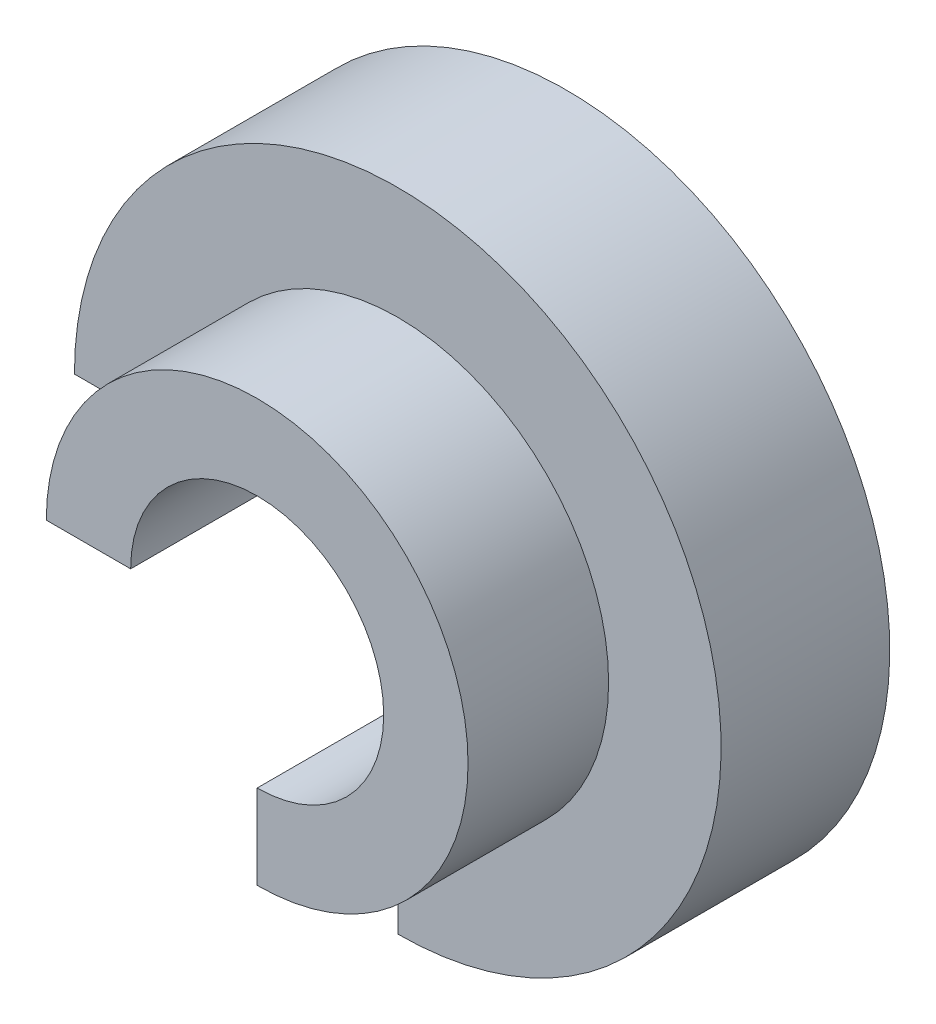
ISO-10303-21;
HEADER;
FILE_DESCRIPTION(('STEP AP214'),'2;1');
FILE_NAME('part.step','',(''),(''),'','','');
FILE_SCHEMA(('AUTOMOTIVE_DESIGN { 1 0 10303 214 1 1 1 1 }'));
ENDSEC;
DATA;
#1=APPLICATION_CONTEXT('core data for automotive mechanical design processes');
#2=APPLICATION_PROTOCOL_DEFINITION('international standard','automotive_design',2000,#1);
#3=PRODUCT_CONTEXT('',#1,'mechanical');
#4=PRODUCT('Part','Part','',(#3));
#5=PRODUCT_RELATED_PRODUCT_CATEGORY('part','',(#4));
#6=PRODUCT_DEFINITION_FORMATION('','',#4);
#7=PRODUCT_DEFINITION_CONTEXT('part definition',#1,'design');
#8=PRODUCT_DEFINITION('design','',#6,#7);
#9=PRODUCT_DEFINITION_SHAPE('','',#8);
#10=(LENGTH_UNIT() NAMED_UNIT(*) SI_UNIT(.MILLI.,.METRE.));
#11=(NAMED_UNIT(*) PLANE_ANGLE_UNIT() SI_UNIT($,.RADIAN.));
#12=(NAMED_UNIT(*) SI_UNIT($,.STERADIAN.) SOLID_ANGLE_UNIT());
#13=UNCERTAINTY_MEASURE_WITH_UNIT(LENGTH_MEASURE(1.E-05),#10,'distance_accuracy_value','');
#14=(GEOMETRIC_REPRESENTATION_CONTEXT(3) GLOBAL_UNCERTAINTY_ASSIGNED_CONTEXT((#13)) GLOBAL_UNIT_ASSIGNED_CONTEXT((#10,
#11,#12)) REPRESENTATION_CONTEXT('',''));
#15=CARTESIAN_POINT('',(0.,0.,0.));
#16=DIRECTION('',(0.,0.,1.));
#17=DIRECTION('',(1.,0.,0.));
#18=AXIS2_PLACEMENT_3D('',#15,#16,#17);
#19=CARTESIAN_POINT('',(0.,0.,150.));
#20=DIRECTION('',(0.,0.,1.));
#21=DIRECTION('',(1.,0.,0.));
#22=AXIS2_PLACEMENT_3D('',#19,#20,#21);
#23=CYLINDRICAL_SURFACE('',#22,59.9999999999999);
#24=CARTESIAN_POINT('',(0.,0.,-150.));
#25=DIRECTION('',(0.,0.,1.));
#26=DIRECTION('',(1.,0.,0.));
#27=AXIS2_PLACEMENT_3D('',#24,#25,#26);
#28=CIRCLE('',#27,59.9999999999999);
#29=CARTESIAN_POINT('',(-6.83575746953394E-13,-59.9999999999999,-150.));
#30=VERTEX_POINT('',#29);
#31=CARTESIAN_POINT('',(-60.,0.,-150.));
#32=VERTEX_POINT('',#31);
#33=EDGE_CURVE('E11',#30,#32,#28,.T.);
#34=ORIENTED_EDGE('',*,*,#33,.F.);
#35=DIRECTION('',(0.,0.,-1.));
#36=VECTOR('',#35,1.);
#37=CARTESIAN_POINT('',(-6.7622786615851E-13,-60.,-110.));
#38=LINE('',#37,#36);
#39=CARTESIAN_POINT('',(-6.7622786615851E-13,-60.,-110.));
#40=VERTEX_POINT('',#39);
#41=EDGE_CURVE('E222',#40,#30,#38,.T.);
#42=ORIENTED_EDGE('',*,*,#41,.F.);
#43=CARTESIAN_POINT('',(0.,0.,-110.));
#44=DIRECTION('',(0.,0.,1.));
#45=DIRECTION('',(1.,0.,0.));
#46=AXIS2_PLACEMENT_3D('',#43,#44,#45);
#47=CIRCLE('',#46,60.);
#48=CARTESIAN_POINT('',(-60.,0.,-110.));
#49=VERTEX_POINT('',#48);
#50=EDGE_CURVE('E48',#40,#49,#47,.T.);
#51=ORIENTED_EDGE('',*,*,#50,.T.);
#52=DIRECTION('',(0.,0.,-1.));
#53=VECTOR('',#52,1.);
#54=CARTESIAN_POINT('',(-60.,0.,-110.));
#55=LINE('',#54,#53);
#56=EDGE_CURVE('E168',#49,#32,#55,.T.);
#57=ORIENTED_EDGE('',*,*,#56,.T.);
#58=EDGE_LOOP('',(#34,#42,#51,#57));
#59=FACE_BOUND('',#58,.T.);
#60=ADVANCED_FACE('F33',(#59),#23,.F.);
#61=CARTESIAN_POINT('',(-6.83575746953394E-13,-59.9999999999999,-150.));
#62=DIRECTION('',(0.,0.,1.));
#63=DIRECTION('',(1.,0.,0.));
#64=AXIS2_PLACEMENT_3D('',#61,#62,#63);
#65=PLANE('',#64);
#66=CARTESIAN_POINT('',(0.,0.,-150.));
#67=DIRECTION('',(0.,0.,1.));
#68=DIRECTION('',(1.,0.,0.));
#69=AXIS2_PLACEMENT_3D('',#66,#67,#68);
#70=CIRCLE('',#69,110.);
#71=CARTESIAN_POINT('',(-1.20729794777986E-12,-110.,-150.));
#72=VERTEX_POINT('',#71);
#73=CARTESIAN_POINT('',(-110.,0.,-150.));
#74=VERTEX_POINT('',#73);
#75=EDGE_CURVE('E41',#72,#74,#70,.T.);
#76=ORIENTED_EDGE('',*,*,#75,.F.);
#77=DIRECTION('',(0.,-1.,0.));
#78=VECTOR('',#77,1.);
#79=CARTESIAN_POINT('',(-6.83575746953394E-13,-59.9999999999999,-150.));
#80=LINE('',#79,#78);
#81=EDGE_CURVE('E164',#30,#72,#80,.T.);
#82=ORIENTED_EDGE('',*,*,#81,.F.);
#83=ORIENTED_EDGE('',*,*,#33,.T.);
#84=DIRECTION('',(-1.,0.,0.));
#85=VECTOR('',#84,1.);
#86=CARTESIAN_POINT('',(-60.,0.,-150.));
#87=LINE('',#86,#85);
#88=EDGE_CURVE('E161',#32,#74,#87,.T.);
#89=ORIENTED_EDGE('',*,*,#88,.T.);
#90=EDGE_LOOP('',(#76,#82,#83,#89));
#91=FACE_BOUND('',#90,.T.);
#92=ADVANCED_FACE('F35',(#91),#65,.F.);
#93=CARTESIAN_POINT('',(0.,0.,150.));
#94=DIRECTION('',(0.,0.,1.));
#95=DIRECTION('',(1.,0.,0.));
#96=AXIS2_PLACEMENT_3D('',#93,#94,#95);
#97=CYLINDRICAL_SURFACE('',#96,110.);
#98=CARTESIAN_POINT('',(0.,0.,-110.));
#99=DIRECTION('',(0.,0.,1.));
#100=DIRECTION('',(1.,0.,0.));
#101=AXIS2_PLACEMENT_3D('',#98,#99,#100);
#102=CIRCLE('',#101,110.);
#103=CARTESIAN_POINT('',(-1.19995006698498E-12,-110.,-110.));
#104=VERTEX_POINT('',#103);
#105=CARTESIAN_POINT('',(-110.,0.,-110.));
#106=VERTEX_POINT('',#105);
#107=EDGE_CURVE('E300',#104,#106,#102,.T.);
#108=ORIENTED_EDGE('',*,*,#107,.F.);
#109=DIRECTION('',(0.,0.,1.));
#110=VECTOR('',#109,1.);
#111=CARTESIAN_POINT('',(-1.20729794777986E-12,-110.,-150.));
#112=LINE('',#111,#110);
#113=EDGE_CURVE('E225',#72,#104,#112,.T.);
#114=ORIENTED_EDGE('',*,*,#113,.F.);
#115=ORIENTED_EDGE('',*,*,#75,.T.);
#116=DIRECTION('',(0.,0.,1.));
#117=VECTOR('',#116,1.);
#118=CARTESIAN_POINT('',(-110.,0.,-150.));
#119=LINE('',#118,#117);
#120=EDGE_CURVE('E175',#74,#106,#119,.T.);
#121=ORIENTED_EDGE('',*,*,#120,.T.);
#122=EDGE_LOOP('',(#108,#114,#115,#121));
#123=FACE_BOUND('',#122,.T.);
#124=ADVANCED_FACE('F303',(#123),#97,.T.);
#125=CARTESIAN_POINT('',(-1.19995006698498E-12,-110.,-110.));
#126=DIRECTION('',(0.,0.,1.));
#127=DIRECTION('',(1.,0.,0.));
#128=AXIS2_PLACEMENT_3D('',#125,#126,#127);
#129=PLANE('',#128);
#130=CARTESIAN_POINT('',(0.,0.,-110.));
#131=DIRECTION('',(0.,0.,1.));
#132=DIRECTION('',(1.,0.,0.));
#133=AXIS2_PLACEMENT_3D('',#130,#131,#132);
#134=CIRCLE('',#133,170.);
#135=CARTESIAN_POINT('',(-1.82841670797674E-12,-170.,-110.));
#136=VERTEX_POINT('',#135);
#137=CARTESIAN_POINT('',(-170.,0.,-110.));
#138=VERTEX_POINT('',#137);
#139=EDGE_CURVE('E298',#136,#138,#134,.T.);
#140=ORIENTED_EDGE('',*,*,#139,.F.);
#141=DIRECTION('',(0.,-1.,0.));
#142=VECTOR('',#141,1.);
#143=CARTESIAN_POINT('',(-1.19995006698498E-12,-110.,-110.));
#144=LINE('',#143,#142);
#145=EDGE_CURVE('E228',#104,#136,#144,.T.);
#146=ORIENTED_EDGE('',*,*,#145,.F.);
#147=ORIENTED_EDGE('',*,*,#107,.T.);
#148=DIRECTION('',(-1.,0.,0.));
#149=VECTOR('',#148,1.);
#150=CARTESIAN_POINT('',(-110.,0.,-110.));
#151=LINE('',#150,#149);
#152=EDGE_CURVE('E177',#106,#138,#151,.T.);
#153=ORIENTED_EDGE('',*,*,#152,.T.);
#154=EDGE_LOOP('',(#140,#146,#147,#153));
#155=FACE_BOUND('',#154,.T.);
#156=ADVANCED_FACE('F359',(#155),#129,.F.);
#157=CARTESIAN_POINT('',(0.,0.,150.));
#158=DIRECTION('',(0.,0.,1.));
#159=DIRECTION('',(1.,0.,0.));
#160=AXIS2_PLACEMENT_3D('',#157,#158,#159);
#161=CYLINDRICAL_SURFACE('',#160,170.);
#162=CARTESIAN_POINT('',(0.,0.,-70.));
#163=DIRECTION('',(0.,0.,1.));
#164=DIRECTION('',(1.,0.,0.));
#165=AXIS2_PLACEMENT_3D('',#162,#163,#164);
#166=CIRCLE('',#165,170.);
#167=CARTESIAN_POINT('',(-1.82106882718186E-12,-170.,-70.));
#168=VERTEX_POINT('',#167);
#169=CARTESIAN_POINT('',(-170.,0.,-70.));
#170=VERTEX_POINT('',#169);
#171=EDGE_CURVE('E296',#168,#170,#166,.T.);
#172=ORIENTED_EDGE('',*,*,#171,.F.);
#173=DIRECTION('',(0.,0.,1.));
#174=VECTOR('',#173,1.);
#175=CARTESIAN_POINT('',(-1.82841670797674E-12,-170.,-110.));
#176=LINE('',#175,#174);
#177=EDGE_CURVE('E231',#136,#168,#176,.T.);
#178=ORIENTED_EDGE('',*,*,#177,.F.);
#179=ORIENTED_EDGE('',*,*,#139,.T.);
#180=DIRECTION('',(0.,0.,1.));
#181=VECTOR('',#180,1.);
#182=CARTESIAN_POINT('',(-170.,0.,-110.));
#183=LINE('',#182,#181);
#184=EDGE_CURVE('E182',#138,#170,#183,.T.);
#185=ORIENTED_EDGE('',*,*,#184,.T.);
#186=EDGE_LOOP('',(#172,#178,#179,#185));
#187=FACE_BOUND('',#186,.T.);
#188=ADVANCED_FACE('F357',(#187),#161,.T.);
#189=CARTESIAN_POINT('',(-1.82106882718186E-12,-170.,-70.));
#190=DIRECTION('',(0.,0.,1.));
#191=DIRECTION('',(1.,0.,0.));
#192=AXIS2_PLACEMENT_3D('',#189,#190,#191);
#193=PLANE('',#192);
#194=CARTESIAN_POINT('',(0.,0.,-70.));
#195=DIRECTION('',(0.,0.,1.));
#196=DIRECTION('',(1.,0.,0.));
#197=AXIS2_PLACEMENT_3D('',#194,#195,#196);
#198=CIRCLE('',#197,230.);
#199=CARTESIAN_POINT('',(-2.44953546817362E-12,-230.,-70.));
#200=VERTEX_POINT('',#199);
#201=CARTESIAN_POINT('',(-230.,0.,-70.));
#202=VERTEX_POINT('',#201);
#203=EDGE_CURVE('E294',#200,#202,#198,.T.);
#204=ORIENTED_EDGE('',*,*,#203,.F.);
#205=DIRECTION('',(0.,-1.,0.));
#206=VECTOR('',#205,1.);
#207=CARTESIAN_POINT('',(-1.82106882718186E-12,-170.,-70.));
#208=LINE('',#207,#206);
#209=EDGE_CURVE('E234',#168,#200,#208,.T.);
#210=ORIENTED_EDGE('',*,*,#209,.F.);
#211=ORIENTED_EDGE('',*,*,#171,.T.);
#212=DIRECTION('',(-1.,0.,0.));
#213=VECTOR('',#212,1.);
#214=CARTESIAN_POINT('',(-170.,0.,-70.));
#215=LINE('',#214,#213);
#216=EDGE_CURVE('E185',#170,#202,#215,.T.);
#217=ORIENTED_EDGE('',*,*,#216,.T.);
#218=EDGE_LOOP('',(#204,#210,#211,#217));
#219=FACE_BOUND('',#218,.T.);
#220=ADVANCED_FACE('F354',(#219),#193,.F.);
#221=CARTESIAN_POINT('',(0.,0.,150.));
#222=DIRECTION('',(0.,0.,1.));
#223=DIRECTION('',(1.,0.,0.));
#224=AXIS2_PLACEMENT_3D('',#221,#222,#223);
#225=CYLINDRICAL_SURFACE('',#224,230.);
#226=CARTESIAN_POINT('',(0.,0.,50.));
#227=DIRECTION('',(0.,0.,1.));
#228=DIRECTION('',(1.,0.,0.));
#229=AXIS2_PLACEMENT_3D('',#226,#227,#228);
#230=CIRCLE('',#229,230.);
#231=CARTESIAN_POINT('',(-2.42749182578897E-12,-230.,50.));
#232=VERTEX_POINT('',#231);
#233=CARTESIAN_POINT('',(-230.,0.,50.));
#234=VERTEX_POINT('',#233);
#235=EDGE_CURVE('E292',#232,#234,#230,.T.);
#236=ORIENTED_EDGE('',*,*,#235,.F.);
#237=DIRECTION('',(0.,0.,1.));
#238=VECTOR('',#237,1.);
#239=CARTESIAN_POINT('',(-2.44953546817362E-12,-230.,-70.));
#240=LINE('',#239,#238);
#241=EDGE_CURVE('E237',#200,#232,#240,.T.);
#242=ORIENTED_EDGE('',*,*,#241,.F.);
#243=ORIENTED_EDGE('',*,*,#203,.T.);
#244=DIRECTION('',(0.,0.,1.));
#245=VECTOR('',#244,1.);
#246=CARTESIAN_POINT('',(-230.,0.,-70.));
#247=LINE('',#246,#245);
#248=EDGE_CURVE('E188',#202,#234,#247,.T.);
#249=ORIENTED_EDGE('',*,*,#248,.T.);
#250=EDGE_LOOP('',(#236,#242,#243,#249));
#251=FACE_BOUND('',#250,.T.);
#252=ADVANCED_FACE('F350',(#251),#225,.T.);
#253=CARTESIAN_POINT('',(-2.42749182578897E-12,-230.,50.));
#254=DIRECTION('',(0.,0.,-1.));
#255=DIRECTION('',(-1.,0.,0.));
#256=AXIS2_PLACEMENT_3D('',#253,#254,#255);
#257=PLANE('',#256);
#258=CARTESIAN_POINT('',(0.,0.,50.));
#259=DIRECTION('',(0.,0.,1.));
#260=DIRECTION('',(1.,0.,0.));
#261=AXIS2_PLACEMENT_3D('',#258,#259,#260);
#262=CIRCLE('',#261,150.);
#263=CARTESIAN_POINT('',(-1.58953630446662E-12,-150.,50.));
#264=VERTEX_POINT('',#263);
#265=CARTESIAN_POINT('',(-150.,0.,50.));
#266=VERTEX_POINT('',#265);
#267=EDGE_CURVE('E290',#264,#266,#262,.T.);
#268=ORIENTED_EDGE('',*,*,#267,.F.);
#269=DIRECTION('',(0.,1.,0.));
#270=VECTOR('',#269,1.);
#271=CARTESIAN_POINT('',(-2.42749182578897E-12,-230.,50.));
#272=LINE('',#271,#270);
#273=EDGE_CURVE('E240',#232,#264,#272,.T.);
#274=ORIENTED_EDGE('',*,*,#273,.F.);
#275=ORIENTED_EDGE('',*,*,#235,.T.);
#276=DIRECTION('',(1.,0.,0.));
#277=VECTOR('',#276,1.);
#278=CARTESIAN_POINT('',(-230.,0.,50.));
#279=LINE('',#278,#277);
#280=EDGE_CURVE('E191',#234,#266,#279,.T.);
#281=ORIENTED_EDGE('',*,*,#280,.T.);
#282=EDGE_LOOP('',(#268,#274,#275,#281));
#283=FACE_BOUND('',#282,.T.);
#284=ADVANCED_FACE('F345',(#283),#257,.F.);
#285=CARTESIAN_POINT('',(0.,0.,150.));
#286=DIRECTION('',(0.,0.,1.));
#287=DIRECTION('',(1.,0.,0.));
#288=AXIS2_PLACEMENT_3D('',#285,#286,#287);
#289=CYLINDRICAL_SURFACE('',#288,150.);
#290=CARTESIAN_POINT('',(0.,0.,150.));
#291=DIRECTION('',(0.,0.,1.));
#292=DIRECTION('',(1.,0.,0.));
#293=AXIS2_PLACEMENT_3D('',#290,#291,#292);
#294=CIRCLE('',#293,150.);
#295=CARTESIAN_POINT('',(-1.57116660247941E-12,-150.,150.));
#296=VERTEX_POINT('',#295);
#297=CARTESIAN_POINT('',(-150.,0.,150.));
#298=VERTEX_POINT('',#297);
#299=EDGE_CURVE('E288',#296,#298,#294,.T.);
#300=ORIENTED_EDGE('',*,*,#299,.F.);
#301=DIRECTION('',(0.,0.,1.));
#302=VECTOR('',#301,1.);
#303=CARTESIAN_POINT('',(-1.58953630446662E-12,-150.,50.));
#304=LINE('',#303,#302);
#305=EDGE_CURVE('E243',#264,#296,#304,.T.);
#306=ORIENTED_EDGE('',*,*,#305,.F.);
#307=ORIENTED_EDGE('',*,*,#267,.T.);
#308=DIRECTION('',(0.,0.,1.));
#309=VECTOR('',#308,1.);
#310=CARTESIAN_POINT('',(-150.,0.,50.));
#311=LINE('',#310,#309);
#312=EDGE_CURVE('E194',#266,#298,#311,.T.);
#313=ORIENTED_EDGE('',*,*,#312,.T.);
#314=EDGE_LOOP('',(#300,#306,#307,#313));
#315=FACE_BOUND('',#314,.T.);
#316=ADVANCED_FACE('F342',(#315),#289,.T.);
#317=CARTESIAN_POINT('',(-1.57116660247941E-12,-150.,150.));
#318=DIRECTION('',(0.,0.,-1.));
#319=DIRECTION('',(-1.,0.,0.));
#320=AXIS2_PLACEMENT_3D('',#317,#318,#319);
#321=PLANE('',#320);
#322=CARTESIAN_POINT('',(0.,0.,150.));
#323=DIRECTION('',(0.,0.,1.));
#324=DIRECTION('',(1.,0.,0.));
#325=AXIS2_PLACEMENT_3D('',#322,#323,#324);
#326=CIRCLE('',#325,90.);
#327=CARTESIAN_POINT('',(-9.42699961487646E-13,-90.,150.));
#328=VERTEX_POINT('',#327);
#329=CARTESIAN_POINT('',(-90.,0.,150.));
#330=VERTEX_POINT('',#329);
#331=EDGE_CURVE('E286',#328,#330,#326,.T.);
#332=ORIENTED_EDGE('',*,*,#331,.F.);
#333=DIRECTION('',(0.,1.,0.));
#334=VECTOR('',#333,1.);
#335=CARTESIAN_POINT('',(-1.57116660247941E-12,-150.,150.));
#336=LINE('',#335,#334);
#337=EDGE_CURVE('E246',#296,#328,#336,.T.);
#338=ORIENTED_EDGE('',*,*,#337,.F.);
#339=ORIENTED_EDGE('',*,*,#299,.T.);
#340=DIRECTION('',(1.,0.,0.));
#341=VECTOR('',#340,1.);
#342=CARTESIAN_POINT('',(-150.,0.,150.));
#343=LINE('',#342,#341);
#344=EDGE_CURVE('E197',#298,#330,#343,.T.);
#345=ORIENTED_EDGE('',*,*,#344,.T.);
#346=EDGE_LOOP('',(#332,#338,#339,#345));
#347=FACE_BOUND('',#346,.T.);
#348=ADVANCED_FACE('F338',(#347),#321,.F.);
#349=CARTESIAN_POINT('',(0.,0.,150.));
#350=DIRECTION('',(0.,0.,1.));
#351=DIRECTION('',(1.,0.,0.));
#352=AXIS2_PLACEMENT_3D('',#349,#350,#351);
#353=CYLINDRICAL_SURFACE('',#352,90.);
#354=CARTESIAN_POINT('',(0.,0.,30.));
#355=DIRECTION('',(0.,0.,1.));
#356=DIRECTION('',(1.,0.,0.));
#357=AXIS2_PLACEMENT_3D('',#354,#355,#356);
#358=CIRCLE('',#357,90.);
#359=CARTESIAN_POINT('',(-9.64743603872298E-13,-90.,30.));
#360=VERTEX_POINT('',#359);
#361=CARTESIAN_POINT('',(-90.,0.,30.));
#362=VERTEX_POINT('',#361);
#363=EDGE_CURVE('E284',#360,#362,#358,.T.);
#364=ORIENTED_EDGE('',*,*,#363,.F.);
#365=DIRECTION('',(0.,0.,-1.));
#366=VECTOR('',#365,1.);
#367=CARTESIAN_POINT('',(-9.42699961487646E-13,-90.,150.));
#368=LINE('',#367,#366);
#369=EDGE_CURVE('E249',#328,#360,#368,.T.);
#370=ORIENTED_EDGE('',*,*,#369,.F.);
#371=ORIENTED_EDGE('',*,*,#331,.T.);
#372=DIRECTION('',(0.,0.,-1.));
#373=VECTOR('',#372,1.);
#374=CARTESIAN_POINT('',(-90.,0.,150.));
#375=LINE('',#374,#373);
#376=EDGE_CURVE('E200',#330,#362,#375,.T.);
#377=ORIENTED_EDGE('',*,*,#376,.T.);
#378=EDGE_LOOP('',(#364,#370,#371,#377));
#379=FACE_BOUND('',#378,.T.);
#380=ADVANCED_FACE('F333',(#379),#353,.F.);
#381=CARTESIAN_POINT('',(-9.64743603872298E-13,-90.,30.));
#382=DIRECTION('',(0.,0.,1.));
#383=DIRECTION('',(1.,0.,0.));
#384=AXIS2_PLACEMENT_3D('',#381,#382,#383);
#385=PLANE('',#384);
#386=CARTESIAN_POINT('',(0.,0.,30.));
#387=DIRECTION('',(0.,0.,1.));
#388=DIRECTION('',(1.,0.,0.));
#389=AXIS2_PLACEMENT_3D('',#386,#387,#388);
#390=CIRCLE('',#389,180.);
#391=CARTESIAN_POINT('',(-1.90744356535994E-12,-180.,30.));
#392=VERTEX_POINT('',#391);
#393=CARTESIAN_POINT('',(-180.,0.,30.));
#394=VERTEX_POINT('',#393);
#395=EDGE_CURVE('E282',#392,#394,#390,.T.);
#396=ORIENTED_EDGE('',*,*,#395,.F.);
#397=DIRECTION('',(0.,-1.,0.));
#398=VECTOR('',#397,1.);
#399=CARTESIAN_POINT('',(-9.64743603872298E-13,-90.,30.));
#400=LINE('',#399,#398);
#401=EDGE_CURVE('E252',#360,#392,#400,.T.);
#402=ORIENTED_EDGE('',*,*,#401,.F.);
#403=ORIENTED_EDGE('',*,*,#363,.T.);
#404=DIRECTION('',(-1.,0.,0.));
#405=VECTOR('',#404,1.);
#406=CARTESIAN_POINT('',(-90.,0.,30.));
#407=LINE('',#406,#405);
#408=EDGE_CURVE('E203',#362,#394,#407,.T.);
#409=ORIENTED_EDGE('',*,*,#408,.T.);
#410=EDGE_LOOP('',(#396,#402,#403,#409));
#411=FACE_BOUND('',#410,.T.);
#412=ADVANCED_FACE('F330',(#411),#385,.F.);
#413=CARTESIAN_POINT('',(0.,0.,150.));
#414=DIRECTION('',(0.,0.,1.));
#415=DIRECTION('',(1.,0.,0.));
#416=AXIS2_PLACEMENT_3D('',#413,#414,#415);
#417=CYLINDRICAL_SURFACE('',#416,180.);
#418=CARTESIAN_POINT('',(0.,0.,-40.));
#419=DIRECTION('',(0.,0.,1.));
#420=DIRECTION('',(1.,0.,0.));
#421=AXIS2_PLACEMENT_3D('',#418,#419,#420);
#422=CIRCLE('',#421,180.);
#423=CARTESIAN_POINT('',(-1.92030235675099E-12,-180.,-40.));
#424=VERTEX_POINT('',#423);
#425=CARTESIAN_POINT('',(-180.,0.,-40.));
#426=VERTEX_POINT('',#425);
#427=EDGE_CURVE('E280',#424,#426,#422,.T.);
#428=ORIENTED_EDGE('',*,*,#427,.F.);
#429=DIRECTION('',(0.,0.,-1.));
#430=VECTOR('',#429,1.);
#431=CARTESIAN_POINT('',(-1.90744356535994E-12,-180.,30.));
#432=LINE('',#431,#430);
#433=EDGE_CURVE('E255',#392,#424,#432,.T.);
#434=ORIENTED_EDGE('',*,*,#433,.F.);
#435=ORIENTED_EDGE('',*,*,#395,.T.);
#436=DIRECTION('',(0.,0.,-1.));
#437=VECTOR('',#436,1.);
#438=CARTESIAN_POINT('',(-180.,0.,30.));
#439=LINE('',#438,#437);
#440=EDGE_CURVE('E206',#394,#426,#439,.T.);
#441=ORIENTED_EDGE('',*,*,#440,.T.);
#442=EDGE_LOOP('',(#428,#434,#435,#441));
#443=FACE_BOUND('',#442,.T.);
#444=ADVANCED_FACE('F326',(#443),#417,.F.);
#445=CARTESIAN_POINT('',(-1.92030235675099E-12,-180.,-40.));
#446=DIRECTION('',(0.,0.,-1.));
#447=DIRECTION('',(-1.,0.,0.));
#448=AXIS2_PLACEMENT_3D('',#445,#446,#447);
#449=PLANE('',#448);
#450=CARTESIAN_POINT('',(0.,0.,-40.));
#451=DIRECTION('',(0.,0.,1.));
#452=DIRECTION('',(1.,0.,0.));
#453=AXIS2_PLACEMENT_3D('',#450,#451,#452);
#454=CIRCLE('',#453,130.);
#455=CARTESIAN_POINT('',(-1.39658015592452E-12,-130.,-40.));
#456=VERTEX_POINT('',#455);
#457=CARTESIAN_POINT('',(-130.,0.,-40.));
#458=VERTEX_POINT('',#457);
#459=EDGE_CURVE('E278',#456,#458,#454,.T.);
#460=ORIENTED_EDGE('',*,*,#459,.F.);
#461=DIRECTION('',(0.,1.,0.));
#462=VECTOR('',#461,1.);
#463=CARTESIAN_POINT('',(-1.92030235675099E-12,-180.,-40.));
#464=LINE('',#463,#462);
#465=EDGE_CURVE('E258',#424,#456,#464,.T.);
#466=ORIENTED_EDGE('',*,*,#465,.F.);
#467=ORIENTED_EDGE('',*,*,#427,.T.);
#468=DIRECTION('',(1.,0.,0.));
#469=VECTOR('',#468,1.);
#470=CARTESIAN_POINT('',(-180.,0.,-40.));
#471=LINE('',#470,#469);
#472=EDGE_CURVE('E209',#426,#458,#471,.T.);
#473=ORIENTED_EDGE('',*,*,#472,.T.);
#474=EDGE_LOOP('',(#460,#466,#467,#473));
#475=FACE_BOUND('',#474,.T.);
#476=ADVANCED_FACE('F321',(#475),#449,.F.);
#477=CARTESIAN_POINT('',(0.,0.,150.));
#478=DIRECTION('',(0.,0.,1.));
#479=DIRECTION('',(1.,0.,0.));
#480=AXIS2_PLACEMENT_3D('',#477,#478,#479);
#481=CYLINDRICAL_SURFACE('',#480,130.);
#482=CARTESIAN_POINT('',(0.,0.,-80.));
#483=DIRECTION('',(0.,0.,1.));
#484=DIRECTION('',(1.,0.,0.));
#485=AXIS2_PLACEMENT_3D('',#482,#483,#484);
#486=CIRCLE('',#485,130.);
#487=CARTESIAN_POINT('',(-1.40392803671941E-12,-130.,-80.));
#488=VERTEX_POINT('',#487);
#489=CARTESIAN_POINT('',(-130.,0.,-80.));
#490=VERTEX_POINT('',#489);
#491=EDGE_CURVE('E276',#488,#490,#486,.T.);
#492=ORIENTED_EDGE('',*,*,#491,.F.);
#493=DIRECTION('',(0.,0.,-1.));
#494=VECTOR('',#493,1.);
#495=CARTESIAN_POINT('',(-1.39658015592452E-12,-130.,-40.));
#496=LINE('',#495,#494);
#497=EDGE_CURVE('E261',#456,#488,#496,.T.);
#498=ORIENTED_EDGE('',*,*,#497,.F.);
#499=ORIENTED_EDGE('',*,*,#459,.T.);
#500=DIRECTION('',(0.,0.,-1.));
#501=VECTOR('',#500,1.);
#502=CARTESIAN_POINT('',(-130.,0.,-40.));
#503=LINE('',#502,#501);
#504=EDGE_CURVE('E212',#458,#490,#503,.T.);
#505=ORIENTED_EDGE('',*,*,#504,.T.);
#506=EDGE_LOOP('',(#492,#498,#499,#505));
#507=FACE_BOUND('',#506,.T.);
#508=ADVANCED_FACE('F318',(#507),#481,.F.);
#509=CARTESIAN_POINT('',(-1.40392803671941E-12,-130.,-80.));
#510=DIRECTION('',(0.,0.,-1.));
#511=DIRECTION('',(-1.,0.,0.));
#512=AXIS2_PLACEMENT_3D('',#509,#510,#511);
#513=PLANE('',#512);
#514=CARTESIAN_POINT('',(0.,0.,-80.));
#515=DIRECTION('',(0.,0.,1.));
#516=DIRECTION('',(1.,0.,0.));
#517=AXIS2_PLACEMENT_3D('',#514,#515,#516);
#518=CIRCLE('',#517,90.);
#519=CARTESIAN_POINT('',(-9.84950276058229E-13,-90.,-80.));
#520=VERTEX_POINT('',#519);
#521=CARTESIAN_POINT('',(-90.,0.,-80.));
#522=VERTEX_POINT('',#521);
#523=EDGE_CURVE('E274',#520,#522,#518,.T.);
#524=ORIENTED_EDGE('',*,*,#523,.F.);
#525=DIRECTION('',(0.,1.,0.));
#526=VECTOR('',#525,1.);
#527=CARTESIAN_POINT('',(-1.40392803671941E-12,-130.,-80.));
#528=LINE('',#527,#526);
#529=EDGE_CURVE('E264',#488,#520,#528,.T.);
#530=ORIENTED_EDGE('',*,*,#529,.F.);
#531=ORIENTED_EDGE('',*,*,#491,.T.);
#532=DIRECTION('',(1.,0.,0.));
#533=VECTOR('',#532,1.);
#534=CARTESIAN_POINT('',(-130.,0.,-80.));
#535=LINE('',#534,#533);
#536=EDGE_CURVE('E215',#490,#522,#535,.T.);
#537=ORIENTED_EDGE('',*,*,#536,.T.);
#538=EDGE_LOOP('',(#524,#530,#531,#537));
#539=FACE_BOUND('',#538,.T.);
#540=ADVANCED_FACE('F314',(#539),#513,.F.);
#541=CARTESIAN_POINT('',(0.,0.,150.));
#542=DIRECTION('',(0.,0.,1.));
#543=DIRECTION('',(1.,0.,0.));
#544=AXIS2_PLACEMENT_3D('',#541,#542,#543);
#545=CYLINDRICAL_SURFACE('',#544,90.);
#546=CARTESIAN_POINT('',(0.,0.,-110.));
#547=DIRECTION('',(0.,0.,1.));
#548=DIRECTION('',(1.,0.,0.));
#549=AXIS2_PLACEMENT_3D('',#546,#547,#548);
#550=CIRCLE('',#549,90.);
#551=CARTESIAN_POINT('',(-9.90461186654392E-13,-90.,-110.));
#552=VERTEX_POINT('',#551);
#553=CARTESIAN_POINT('',(-90.,0.,-110.));
#554=VERTEX_POINT('',#553);
#555=EDGE_CURVE('E56',#552,#554,#550,.T.);
#556=ORIENTED_EDGE('',*,*,#555,.F.);
#557=DIRECTION('',(0.,0.,-1.));
#558=VECTOR('',#557,1.);
#559=CARTESIAN_POINT('',(-9.84950276058229E-13,-90.,-80.));
#560=LINE('',#559,#558);
#561=EDGE_CURVE('E267',#520,#552,#560,.T.);
#562=ORIENTED_EDGE('',*,*,#561,.F.);
#563=ORIENTED_EDGE('',*,*,#523,.T.);
#564=DIRECTION('',(0.,0.,-1.));
#565=VECTOR('',#564,1.);
#566=CARTESIAN_POINT('',(-90.,0.,-80.));
#567=LINE('',#566,#565);
#568=EDGE_CURVE('E218',#522,#554,#567,.T.);
#569=ORIENTED_EDGE('',*,*,#568,.T.);
#570=EDGE_LOOP('',(#556,#562,#563,#569));
#571=FACE_BOUND('',#570,.T.);
#572=ADVANCED_FACE('F309',(#571),#545,.F.);
#573=CARTESIAN_POINT('',(-9.90461186654392E-13,-90.,-110.));
#574=DIRECTION('',(0.,0.,-1.));
#575=DIRECTION('',(-1.,0.,0.));
#576=AXIS2_PLACEMENT_3D('',#573,#574,#575);
#577=PLANE('',#576);
#578=DIRECTION('',(0.,1.,0.));
#579=VECTOR('',#578,1.);
#580=CARTESIAN_POINT('',(-9.90461186654392E-13,-90.,-110.));
#581=LINE('',#580,#579);
#582=EDGE_CURVE('E269',#552,#40,#581,.T.);
#583=ORIENTED_EDGE('',*,*,#582,.F.);
#584=ORIENTED_EDGE('',*,*,#555,.T.);
#585=DIRECTION('',(1.,0.,0.));
#586=VECTOR('',#585,1.);
#587=CARTESIAN_POINT('',(-90.,0.,-110.));
#588=LINE('',#587,#586);
#589=EDGE_CURVE('E220',#554,#49,#588,.T.);
#590=ORIENTED_EDGE('',*,*,#589,.T.);
#591=ORIENTED_EDGE('',*,*,#50,.F.);
#592=EDGE_LOOP('',(#583,#584,#590,#591));
#593=FACE_BOUND('',#592,.T.);
#594=ADVANCED_FACE('F307',(#593),#577,.F.);
#595=CARTESIAN_POINT('',(0.,0.,0.));
#596=DIRECTION('',(-1.,0.,0.));
#597=DIRECTION('',(0.,0.,1.));
#598=AXIS2_PLACEMENT_3D('',#595,#596,#597);
#599=PLANE('',#598);
#600=ORIENTED_EDGE('',*,*,#41,.T.);
#601=ORIENTED_EDGE('',*,*,#81,.T.);
#602=ORIENTED_EDGE('',*,*,#113,.T.);
#603=ORIENTED_EDGE('',*,*,#145,.T.);
#604=ORIENTED_EDGE('',*,*,#177,.T.);
#605=ORIENTED_EDGE('',*,*,#209,.T.);
#606=ORIENTED_EDGE('',*,*,#241,.T.);
#607=ORIENTED_EDGE('',*,*,#273,.T.);
#608=ORIENTED_EDGE('',*,*,#305,.T.);
#609=ORIENTED_EDGE('',*,*,#337,.T.);
#610=ORIENTED_EDGE('',*,*,#369,.T.);
#611=ORIENTED_EDGE('',*,*,#401,.T.);
#612=ORIENTED_EDGE('',*,*,#433,.T.);
#613=ORIENTED_EDGE('',*,*,#465,.T.);
#614=ORIENTED_EDGE('',*,*,#497,.T.);
#615=ORIENTED_EDGE('',*,*,#529,.T.);
#616=ORIENTED_EDGE('',*,*,#561,.T.);
#617=ORIENTED_EDGE('',*,*,#582,.T.);
#618=EDGE_LOOP('',(#600,#601,#602,#603,#604,#605,#606,#607,#608,#609,#610,#611,#612,#613,#614,
#615,#616,#617));
#619=FACE_BOUND('',#618,.T.);
#620=ADVANCED_FACE('F305',(#619),#599,.T.);
#621=CARTESIAN_POINT('',(0.,0.,0.));
#622=DIRECTION('',(0.,1.,0.));
#623=DIRECTION('',(0.,0.,1.));
#624=AXIS2_PLACEMENT_3D('',#621,#622,#623);
#625=PLANE('',#624);
#626=ORIENTED_EDGE('',*,*,#56,.F.);
#627=ORIENTED_EDGE('',*,*,#589,.F.);
#628=ORIENTED_EDGE('',*,*,#568,.F.);
#629=ORIENTED_EDGE('',*,*,#536,.F.);
#630=ORIENTED_EDGE('',*,*,#504,.F.);
#631=ORIENTED_EDGE('',*,*,#472,.F.);
#632=ORIENTED_EDGE('',*,*,#440,.F.);
#633=ORIENTED_EDGE('',*,*,#408,.F.);
#634=ORIENTED_EDGE('',*,*,#376,.F.);
#635=ORIENTED_EDGE('',*,*,#344,.F.);
#636=ORIENTED_EDGE('',*,*,#312,.F.);
#637=ORIENTED_EDGE('',*,*,#280,.F.);
#638=ORIENTED_EDGE('',*,*,#248,.F.);
#639=ORIENTED_EDGE('',*,*,#216,.F.);
#640=ORIENTED_EDGE('',*,*,#184,.F.);
#641=ORIENTED_EDGE('',*,*,#152,.F.);
#642=ORIENTED_EDGE('',*,*,#120,.F.);
#643=ORIENTED_EDGE('',*,*,#88,.F.);
#644=EDGE_LOOP('',(#626,#627,#628,#629,#630,#631,#632,#633,#634,#635,#636,#637,#638,#639,#640,
#641,#642,#643));
#645=FACE_BOUND('',#644,.T.);
#646=ADVANCED_FACE('F172',(#645),#625,.F.);
#647=CLOSED_SHELL('',(#60,#92,#124,#156,#188,#220,#252,#284,#316,#348,#380,#412,#444,#476,#508,
#540,#572,#594,#620,#646));
#648=MANIFOLD_SOLID_BREP('B2',#647);
#649=ADVANCED_BREP_SHAPE_REPRESENTATION('',(#18,#648),#14);
#650=SHAPE_DEFINITION_REPRESENTATION(#9,#649);
ENDSEC;
END-ISO-10303-21;
